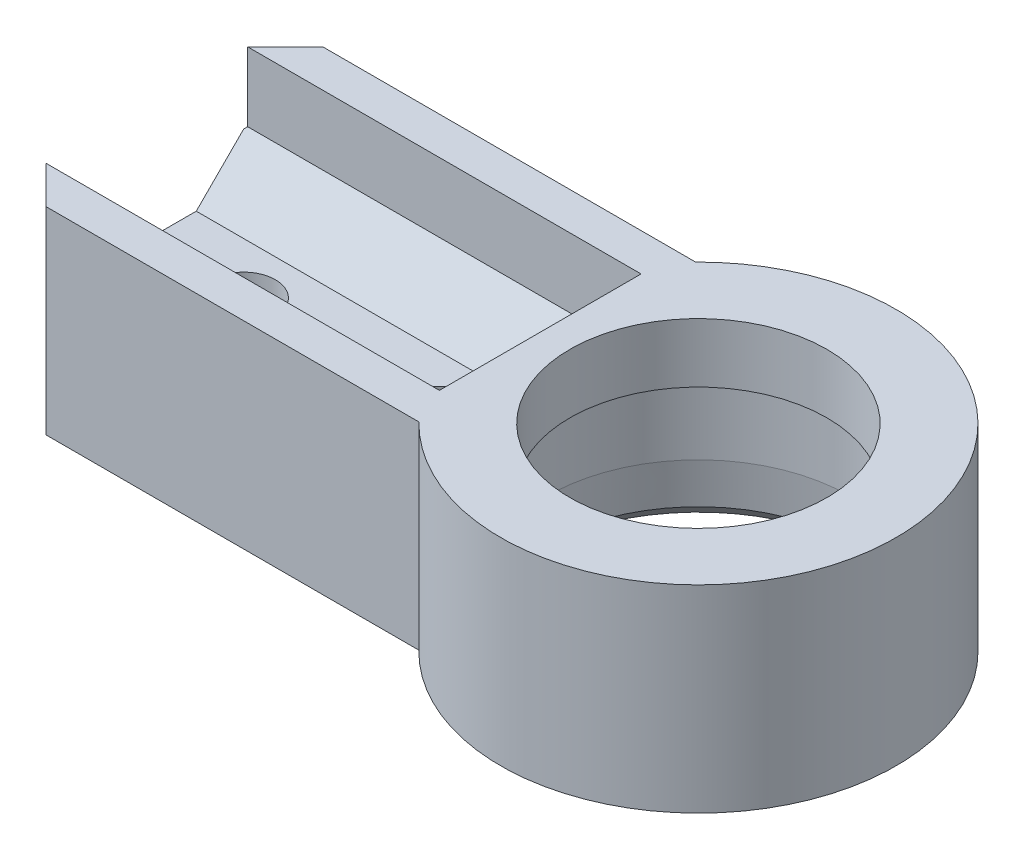
ISO-10303-21;
HEADER;
FILE_DESCRIPTION(('STEP AP214'),'2;1');
FILE_NAME('part.step','',(''),(''),'','','');
FILE_SCHEMA(('AUTOMOTIVE_DESIGN { 1 0 10303 214 1 1 1 1 }'));
ENDSEC;
DATA;
#1=APPLICATION_CONTEXT('core data for automotive mechanical design processes');
#2=APPLICATION_PROTOCOL_DEFINITION('international standard','automotive_design',2000,#1);
#3=PRODUCT_CONTEXT('',#1,'mechanical');
#4=PRODUCT('Part','Part','',(#3));
#5=PRODUCT_RELATED_PRODUCT_CATEGORY('part','',(#4));
#6=PRODUCT_DEFINITION_FORMATION('','',#4);
#7=PRODUCT_DEFINITION_CONTEXT('part definition',#1,'design');
#8=PRODUCT_DEFINITION('design','',#6,#7);
#9=PRODUCT_DEFINITION_SHAPE('','',#8);
#10=(LENGTH_UNIT() NAMED_UNIT(*) SI_UNIT(.MILLI.,.METRE.));
#11=(NAMED_UNIT(*) PLANE_ANGLE_UNIT() SI_UNIT($,.RADIAN.));
#12=(NAMED_UNIT(*) SI_UNIT($,.STERADIAN.) SOLID_ANGLE_UNIT());
#13=UNCERTAINTY_MEASURE_WITH_UNIT(LENGTH_MEASURE(1.E-05),#10,'distance_accuracy_value','');
#14=(GEOMETRIC_REPRESENTATION_CONTEXT(3) GLOBAL_UNCERTAINTY_ASSIGNED_CONTEXT((#13)) GLOBAL_UNIT_ASSIGNED_CONTEXT((#10,
#11,#12)) REPRESENTATION_CONTEXT('',''));
#15=CARTESIAN_POINT('',(0.,0.,0.));
#16=DIRECTION('',(0.,0.,1.));
#17=DIRECTION('',(1.,0.,0.));
#18=AXIS2_PLACEMENT_3D('',#15,#16,#17);
#19=CARTESIAN_POINT('',(0.,10.,0.));
#20=DIRECTION('',(0.,-1.,0.));
#21=DIRECTION('',(0.,0.,-1.));
#22=AXIS2_PLACEMENT_3D('',#19,#20,#21);
#23=CYLINDRICAL_SURFACE('',#22,6.5);
#24=CARTESIAN_POINT('',(0.,10.,0.));
#25=DIRECTION('',(0.,-1.,0.));
#26=DIRECTION('',(0.,0.,-1.));
#27=AXIS2_PLACEMENT_3D('',#24,#25,#26);
#28=CIRCLE('',#27,6.5);
#29=CARTESIAN_POINT('',(0.,10.,-6.5));
#30=VERTEX_POINT('',#29);
#31=EDGE_CURVE('E224',#30,#30,#28,.T.);
#32=ORIENTED_EDGE('',*,*,#31,.F.);
#33=EDGE_LOOP('',(#32));
#34=FACE_BOUND('',#33,.T.);
#35=CARTESIAN_POINT('',(0.,7.,0.));
#36=DIRECTION('',(0.,-1.,0.));
#37=DIRECTION('',(0.,0.,-1.));
#38=AXIS2_PLACEMENT_3D('',#35,#36,#37);
#39=CIRCLE('',#38,6.5);
#40=CARTESIAN_POINT('',(0.,7.,-6.5));
#41=VERTEX_POINT('',#40);
#42=EDGE_CURVE('E227',#41,#41,#39,.F.);
#43=ORIENTED_EDGE('',*,*,#42,.F.);
#44=EDGE_LOOP('',(#43));
#45=FACE_BOUND('',#44,.T.);
#46=ADVANCED_FACE('F33',(#34,#45),#23,.F.);
#47=CARTESIAN_POINT('',(0.,10.,0.));
#48=DIRECTION('',(0.,-1.,0.));
#49=DIRECTION('',(0.,0.,-1.));
#50=AXIS2_PLACEMENT_3D('',#47,#48,#49);
#51=CYLINDRICAL_SURFACE('',#50,10.);
#52=CARTESIAN_POINT('',(0.,0.,0.));
#53=DIRECTION('',(0.,1.,0.));
#54=DIRECTION('',(0.,0.,1.));
#55=AXIS2_PLACEMENT_3D('',#52,#53,#54);
#56=CIRCLE('',#55,10.);
#57=CARTESIAN_POINT('',(-7.14142842854285,0.,7.));
#58=VERTEX_POINT('',#57);
#59=CARTESIAN_POINT('',(-7.14142842854285,0.,-7.));
#60=VERTEX_POINT('',#59);
#61=EDGE_CURVE('E161',#58,#60,#56,.T.);
#62=ORIENTED_EDGE('',*,*,#61,.T.);
#63=DIRECTION('',(0.,-1.,0.));
#64=VECTOR('',#63,1.);
#65=CARTESIAN_POINT('',(-7.14142842854285,10.,-7.));
#66=LINE('',#65,#64);
#67=CARTESIAN_POINT('',(-7.14142842854285,10.,-7.));
#68=VERTEX_POINT('',#67);
#69=EDGE_CURVE('E186',#68,#60,#66,.T.);
#70=ORIENTED_EDGE('',*,*,#69,.F.);
#71=CARTESIAN_POINT('',(0.,10.,0.));
#72=DIRECTION('',(0.,1.,0.));
#73=DIRECTION('',(0.,0.,1.));
#74=AXIS2_PLACEMENT_3D('',#71,#72,#73);
#75=CIRCLE('',#74,10.);
#76=CARTESIAN_POINT('',(-7.14142842854285,10.,7.));
#77=VERTEX_POINT('',#76);
#78=EDGE_CURVE('E169',#77,#68,#75,.T.);
#79=ORIENTED_EDGE('',*,*,#78,.F.);
#80=DIRECTION('',(0.,-1.,0.));
#81=VECTOR('',#80,1.);
#82=CARTESIAN_POINT('',(-7.14142842854285,10.,7.));
#83=LINE('',#82,#81);
#84=EDGE_CURVE('E176',#77,#58,#83,.T.);
#85=ORIENTED_EDGE('',*,*,#84,.T.);
#86=EDGE_LOOP('',(#62,#70,#79,#85));
#87=FACE_BOUND('',#86,.T.);
#88=ADVANCED_FACE('F289',(#87),#51,.T.);
#89=CARTESIAN_POINT('',(-28.,10.,-7.));
#90=DIRECTION('',(0.,0.,1.));
#91=DIRECTION('',(1.,0.,0.));
#92=AXIS2_PLACEMENT_3D('',#89,#90,#91);
#93=PLANE('',#92);
#94=DIRECTION('',(-1.,0.,0.));
#95=VECTOR('',#94,1.);
#96=CARTESIAN_POINT('',(-28.,0.,-7.));
#97=LINE('',#96,#95);
#98=CARTESIAN_POINT('',(-26.,0.,-7.));
#99=VERTEX_POINT('',#98);
#100=EDGE_CURVE('E164',#60,#99,#97,.T.);
#101=ORIENTED_EDGE('',*,*,#100,.T.);
#102=DIRECTION('',(0.,1.,0.));
#103=VECTOR('',#102,1.);
#104=CARTESIAN_POINT('',(-26.,10.,-7.));
#105=LINE('',#104,#103);
#106=CARTESIAN_POINT('',(-26.,10.,-7.));
#107=VERTEX_POINT('',#106);
#108=EDGE_CURVE('E260',#99,#107,#105,.T.);
#109=ORIENTED_EDGE('',*,*,#108,.T.);
#110=DIRECTION('',(-1.,0.,0.));
#111=VECTOR('',#110,1.);
#112=CARTESIAN_POINT('',(-28.,10.,-7.));
#113=LINE('',#112,#111);
#114=EDGE_CURVE('E172',#68,#107,#113,.T.);
#115=ORIENTED_EDGE('',*,*,#114,.F.);
#116=ORIENTED_EDGE('',*,*,#69,.T.);
#117=EDGE_LOOP('',(#101,#109,#115,#116));
#118=FACE_BOUND('',#117,.T.);
#119=ADVANCED_FACE('F295',(#118),#93,.F.);
#120=CARTESIAN_POINT('',(-28.,10.,7.));
#121=DIRECTION('',(1.,0.,0.));
#122=DIRECTION('',(0.,0.,-1.));
#123=AXIS2_PLACEMENT_3D('',#120,#121,#122);
#124=PLANE('',#123);
#125=DIRECTION('',(0.,-0.707106781186543,0.707106781186552));
#126=VECTOR('',#125,1.);
#127=CARTESIAN_POINT('',(-28.,2.19999999999998,-0.799999999999925));
#128=LINE('',#127,#126);
#129=CARTESIAN_POINT('',(-28.,4.,-2.59999999999997));
#130=VERTEX_POINT('',#129);
#131=CARTESIAN_POINT('',(-28.,6.4,-5.));
#132=VERTEX_POINT('',#131);
#133=EDGE_CURVE('E200',#130,#132,#128,.F.);
#134=ORIENTED_EDGE('',*,*,#133,.T.);
#135=DIRECTION('',(0.,-1.,0.));
#136=VECTOR('',#135,1.);
#137=CARTESIAN_POINT('',(-28.,10.,-5.00000000000001));
#138=LINE('',#137,#136);
#139=CARTESIAN_POINT('',(-28.,0.,-5.00000000000001));
#140=VERTEX_POINT('',#139);
#141=EDGE_CURVE('E253',#132,#140,#138,.T.);
#142=ORIENTED_EDGE('',*,*,#141,.T.);
#143=DIRECTION('',(0.,0.,1.));
#144=VECTOR('',#143,1.);
#145=CARTESIAN_POINT('',(-28.,0.,7.));
#146=LINE('',#145,#144);
#147=CARTESIAN_POINT('',(-28.,0.,4.99999999999999));
#148=VERTEX_POINT('',#147);
#149=EDGE_CURVE('E180',#140,#148,#146,.T.);
#150=ORIENTED_EDGE('',*,*,#149,.T.);
#151=DIRECTION('',(0.,1.,0.));
#152=VECTOR('',#151,1.);
#153=CARTESIAN_POINT('',(-28.,10.,4.99999999999999));
#154=LINE('',#153,#152);
#155=CARTESIAN_POINT('',(-28.,6.40000000000001,5.));
#156=VERTEX_POINT('',#155);
#157=EDGE_CURVE('E251',#148,#156,#154,.T.);
#158=ORIENTED_EDGE('',*,*,#157,.T.);
#159=DIRECTION('',(0.,0.707106781186551,0.707106781186544));
#160=VECTOR('',#159,1.);
#161=CARTESIAN_POINT('',(-28.,9.20000000000002,7.79999999999998));
#162=LINE('',#161,#160);
#163=CARTESIAN_POINT('',(-28.,4.,2.60000000000001));
#164=VERTEX_POINT('',#163);
#165=EDGE_CURVE('E198',#156,#164,#162,.F.);
#166=ORIENTED_EDGE('',*,*,#165,.T.);
#167=DIRECTION('',(0.,0.,1.));
#168=VECTOR('',#167,1.);
#169=CARTESIAN_POINT('',(-28.,4.,-5.1));
#170=LINE('',#169,#168);
#171=EDGE_CURVE('E145',#130,#164,#170,.T.);
#172=ORIENTED_EDGE('',*,*,#171,.F.);
#173=EDGE_LOOP('',(#134,#142,#150,#158,#166,#172));
#174=FACE_BOUND('',#173,.T.);
#175=ADVANCED_FACE('F326',(#174),#124,.F.);
#176=CARTESIAN_POINT('',(-28.,10.,7.));
#177=DIRECTION('',(0.,0.,-1.));
#178=DIRECTION('',(-1.,0.,0.));
#179=AXIS2_PLACEMENT_3D('',#176,#177,#178);
#180=PLANE('',#179);
#181=DIRECTION('',(1.,0.,0.));
#182=VECTOR('',#181,1.);
#183=CARTESIAN_POINT('',(-28.,10.,7.));
#184=LINE('',#183,#182);
#185=CARTESIAN_POINT('',(-26.,10.,7.));
#186=VERTEX_POINT('',#185);
#187=EDGE_CURVE('E175',#186,#77,#184,.T.);
#188=ORIENTED_EDGE('',*,*,#187,.F.);
#189=DIRECTION('',(0.,-1.,0.));
#190=VECTOR('',#189,1.);
#191=CARTESIAN_POINT('',(-26.,10.,7.));
#192=LINE('',#191,#190);
#193=CARTESIAN_POINT('',(-26.,0.,7.));
#194=VERTEX_POINT('',#193);
#195=EDGE_CURVE('E268',#186,#194,#192,.T.);
#196=ORIENTED_EDGE('',*,*,#195,.T.);
#197=DIRECTION('',(1.,0.,0.));
#198=VECTOR('',#197,1.);
#199=CARTESIAN_POINT('',(-28.,0.,7.));
#200=LINE('',#199,#198);
#201=EDGE_CURVE('E173',#194,#58,#200,.T.);
#202=ORIENTED_EDGE('',*,*,#201,.T.);
#203=ORIENTED_EDGE('',*,*,#84,.F.);
#204=EDGE_LOOP('',(#188,#196,#202,#203));
#205=FACE_BOUND('',#204,.T.);
#206=ADVANCED_FACE('F319',(#205),#180,.F.);
#207=CARTESIAN_POINT('',(0.,10.,0.));
#208=DIRECTION('',(0.,1.,0.));
#209=DIRECTION('',(0.,0.,1.));
#210=AXIS2_PLACEMENT_3D('',#207,#208,#209);
#211=PLANE('',#210);
#212=ORIENTED_EDGE('',*,*,#31,.T.);
#213=EDGE_LOOP('',(#212));
#214=FACE_BOUND('',#213,.T.);
#215=ORIENTED_EDGE('',*,*,#114,.T.);
#216=DIRECTION('',(0.707106781186549,0.,-0.707106781186546));
#217=VECTOR('',#216,1.);
#218=CARTESIAN_POINT('',(-16.4999999999999,10.,-16.5));
#219=LINE('',#218,#217);
#220=CARTESIAN_POINT('',(-27.9,10.,-5.1));
#221=VERTEX_POINT('',#220);
#222=EDGE_CURVE('E160',#107,#221,#219,.F.);
#223=ORIENTED_EDGE('',*,*,#222,.T.);
#224=DIRECTION('',(-1.,0.,0.));
#225=VECTOR('',#224,1.);
#226=CARTESIAN_POINT('',(-8.,10.,-5.1));
#227=LINE('',#226,#225);
#228=CARTESIAN_POINT('',(-8.,10.,-5.1));
#229=VERTEX_POINT('',#228);
#230=EDGE_CURVE('E139',#229,#221,#227,.T.);
#231=ORIENTED_EDGE('',*,*,#230,.F.);
#232=DIRECTION('',(0.,0.,-1.));
#233=VECTOR('',#232,1.);
#234=CARTESIAN_POINT('',(-8.,10.,-5.1));
#235=LINE('',#234,#233);
#236=CARTESIAN_POINT('',(-8.,10.,5.1));
#237=VERTEX_POINT('',#236);
#238=EDGE_CURVE('E148',#237,#229,#235,.T.);
#239=ORIENTED_EDGE('',*,*,#238,.F.);
#240=DIRECTION('',(-1.,0.,0.));
#241=VECTOR('',#240,1.);
#242=CARTESIAN_POINT('',(-8.,10.,5.1));
#243=LINE('',#242,#241);
#244=CARTESIAN_POINT('',(-27.9,10.,5.1));
#245=VERTEX_POINT('',#244);
#246=EDGE_CURVE('E155',#237,#245,#243,.T.);
#247=ORIENTED_EDGE('',*,*,#246,.T.);
#248=DIRECTION('',(-0.707106781186546,0.,-0.707106781186549));
#249=VECTOR('',#248,1.);
#250=CARTESIAN_POINT('',(-16.5000000000001,10.,16.5));
#251=LINE('',#250,#249);
#252=EDGE_CURVE('E262',#245,#186,#251,.F.);
#253=ORIENTED_EDGE('',*,*,#252,.T.);
#254=ORIENTED_EDGE('',*,*,#187,.T.);
#255=ORIENTED_EDGE('',*,*,#78,.T.);
#256=EDGE_LOOP('',(#215,#223,#231,#239,#247,#253,#254,#255));
#257=FACE_BOUND('',#256,.T.);
#258=ADVANCED_FACE('F158',(#214,#257),#211,.T.);
#259=CARTESIAN_POINT('',(0.,0.,0.));
#260=DIRECTION('',(0.,1.,0.));
#261=DIRECTION('',(0.,0.,1.));
#262=AXIS2_PLACEMENT_3D('',#259,#260,#261);
#263=PLANE('',#262);
#264=CARTESIAN_POINT('',(-23.,0.,0.));
#265=DIRECTION('',(0.,1.,0.));
#266=DIRECTION('',(0.,0.,1.));
#267=AXIS2_PLACEMENT_3D('',#264,#265,#266);
#268=CIRCLE('',#267,3.70000000000001);
#269=CARTESIAN_POINT('',(-23.,0.,3.70000000000001));
#270=VERTEX_POINT('',#269);
#271=EDGE_CURVE('E245',#270,#270,#268,.T.);
#272=ORIENTED_EDGE('',*,*,#271,.T.);
#273=EDGE_LOOP('',(#272));
#274=FACE_BOUND('',#273,.T.);
#275=CARTESIAN_POINT('',(-13.,0.,0.));
#276=DIRECTION('',(0.,1.,0.));
#277=DIRECTION('',(0.,0.,1.));
#278=AXIS2_PLACEMENT_3D('',#275,#276,#277);
#279=CIRCLE('',#278,3.70000000000001);
#280=CARTESIAN_POINT('',(-13.,0.,3.70000000000001));
#281=VERTEX_POINT('',#280);
#282=EDGE_CURVE('E242',#281,#281,#279,.T.);
#283=ORIENTED_EDGE('',*,*,#282,.T.);
#284=EDGE_LOOP('',(#283));
#285=FACE_BOUND('',#284,.T.);
#286=CARTESIAN_POINT('',(0.,0.,0.));
#287=DIRECTION('',(0.,1.,0.));
#288=DIRECTION('',(0.,0.,1.));
#289=AXIS2_PLACEMENT_3D('',#286,#287,#288);
#290=CIRCLE('',#289,8.65000000000001);
#291=CARTESIAN_POINT('',(0.,0.,8.65000000000001));
#292=VERTEX_POINT('',#291);
#293=EDGE_CURVE('E219',#292,#292,#290,.T.);
#294=ORIENTED_EDGE('',*,*,#293,.T.);
#295=EDGE_LOOP('',(#294));
#296=FACE_BOUND('',#295,.T.);
#297=ORIENTED_EDGE('',*,*,#149,.F.);
#298=DIRECTION('',(-0.707106781186549,0.,0.707106781186546));
#299=VECTOR('',#298,1.);
#300=CARTESIAN_POINT('',(-28.,0.,-5.00000000000001));
#301=LINE('',#300,#299);
#302=EDGE_CURVE('E258',#140,#99,#301,.F.);
#303=ORIENTED_EDGE('',*,*,#302,.T.);
#304=ORIENTED_EDGE('',*,*,#100,.F.);
#305=ORIENTED_EDGE('',*,*,#61,.F.);
#306=ORIENTED_EDGE('',*,*,#201,.F.);
#307=DIRECTION('',(0.707106781186546,0.,0.707106781186549));
#308=VECTOR('',#307,1.);
#309=CARTESIAN_POINT('',(-26.,0.,7.));
#310=LINE('',#309,#308);
#311=EDGE_CURVE('E256',#194,#148,#310,.F.);
#312=ORIENTED_EDGE('',*,*,#311,.T.);
#313=EDGE_LOOP('',(#297,#303,#304,#305,#306,#312));
#314=FACE_BOUND('',#313,.T.);
#315=ADVANCED_FACE('F316',(#274,#285,#296,#314),#263,.F.);
#316=CARTESIAN_POINT('',(-8.,10.,-5.1));
#317=DIRECTION('',(0.,0.,-1.));
#318=DIRECTION('',(-1.,0.,0.));
#319=AXIS2_PLACEMENT_3D('',#316,#317,#318);
#320=PLANE('',#319);
#321=ORIENTED_EDGE('',*,*,#230,.T.);
#322=DIRECTION('',(0.,1.,0.));
#323=VECTOR('',#322,1.);
#324=CARTESIAN_POINT('',(-27.9,10.,-5.1));
#325=LINE('',#324,#323);
#326=CARTESIAN_POINT('',(-27.9,6.5,-5.1));
#327=VERTEX_POINT('',#326);
#328=EDGE_CURVE('E56',#221,#327,#325,.F.);
#329=ORIENTED_EDGE('',*,*,#328,.T.);
#330=DIRECTION('',(1.,0.,0.));
#331=VECTOR('',#330,1.);
#332=CARTESIAN_POINT('',(-8.,6.5,-5.1));
#333=LINE('',#332,#331);
#334=CARTESIAN_POINT('',(-9.79999999999999,6.5,-5.1));
#335=VERTEX_POINT('',#334);
#336=EDGE_CURVE('E196',#327,#335,#333,.T.);
#337=ORIENTED_EDGE('',*,*,#336,.T.);
#338=DIRECTION('',(-0.577350269189624,-0.816496580927727,0.));
#339=VECTOR('',#338,1.);
#340=CARTESIAN_POINT('',(-11.334146220588,4.33038960818106,-5.1));
#341=LINE('',#340,#339);
#342=CARTESIAN_POINT('',(-8.,9.04558441227156,-5.1));
#343=VERTEX_POINT('',#342);
#344=EDGE_CURVE('E141',#335,#343,#341,.F.);
#345=ORIENTED_EDGE('',*,*,#344,.T.);
#346=DIRECTION('',(0.,-1.,0.));
#347=VECTOR('',#346,1.);
#348=CARTESIAN_POINT('',(-8.,10.,-5.1));
#349=LINE('',#348,#347);
#350=EDGE_CURVE('E135',#229,#343,#349,.T.);
#351=ORIENTED_EDGE('',*,*,#350,.F.);
#352=EDGE_LOOP('',(#321,#329,#337,#345,#351));
#353=FACE_BOUND('',#352,.T.);
#354=ADVANCED_FACE('F137',(#353),#320,.F.);
#355=CARTESIAN_POINT('',(-8.,10.,5.1));
#356=DIRECTION('',(0.,0.,1.));
#357=DIRECTION('',(1.,0.,0.));
#358=AXIS2_PLACEMENT_3D('',#355,#356,#357);
#359=PLANE('',#358);
#360=DIRECTION('',(-1.,0.,0.));
#361=VECTOR('',#360,1.);
#362=CARTESIAN_POINT('',(-28.,6.50000000000001,5.1));
#363=LINE('',#362,#361);
#364=CARTESIAN_POINT('',(-9.79999999999999,6.50000000000001,5.1));
#365=VERTEX_POINT('',#364);
#366=CARTESIAN_POINT('',(-27.9,6.50000000000001,5.1));
#367=VERTEX_POINT('',#366);
#368=EDGE_CURVE('E189',#365,#367,#363,.T.);
#369=ORIENTED_EDGE('',*,*,#368,.T.);
#370=DIRECTION('',(0.,-1.,0.));
#371=VECTOR('',#370,1.);
#372=CARTESIAN_POINT('',(-27.9,10.,5.1));
#373=LINE('',#372,#371);
#374=EDGE_CURVE('E272',#367,#245,#373,.F.);
#375=ORIENTED_EDGE('',*,*,#374,.T.);
#376=ORIENTED_EDGE('',*,*,#246,.F.);
#377=DIRECTION('',(0.,1.,0.));
#378=VECTOR('',#377,1.);
#379=CARTESIAN_POINT('',(-8.,10.,5.1));
#380=LINE('',#379,#378);
#381=CARTESIAN_POINT('',(-8.,9.0455844122716,5.1));
#382=VERTEX_POINT('',#381);
#383=EDGE_CURVE('E144',#382,#237,#380,.T.);
#384=ORIENTED_EDGE('',*,*,#383,.F.);
#385=DIRECTION('',(0.57735026918962,0.81649658092773,0.));
#386=VECTOR('',#385,1.);
#387=CARTESIAN_POINT('',(-11.334146220588,4.33038960818099,5.1));
#388=LINE('',#387,#386);
#389=EDGE_CURVE('E209',#382,#365,#388,.F.);
#390=ORIENTED_EDGE('',*,*,#389,.T.);
#391=EDGE_LOOP('',(#369,#375,#376,#384,#390));
#392=FACE_BOUND('',#391,.T.);
#393=ADVANCED_FACE('F307',(#392),#359,.F.);
#394=CARTESIAN_POINT('',(-8.,4.,-5.1));
#395=DIRECTION('',(0.,-1.,0.));
#396=DIRECTION('',(0.,0.,-1.));
#397=AXIS2_PLACEMENT_3D('',#394,#395,#396);
#398=PLANE('',#397);
#399=CARTESIAN_POINT('',(-13.,4.,0.));
#400=DIRECTION('',(0.,-1.,0.));
#401=DIRECTION('',(0.,0.,-1.));
#402=AXIS2_PLACEMENT_3D('',#399,#400,#401);
#403=CIRCLE('',#402,1.6);
#404=CARTESIAN_POINT('',(-13.,4.,-1.6));
#405=VERTEX_POINT('',#404);
#406=EDGE_CURVE('E237',#405,#405,#403,.T.);
#407=ORIENTED_EDGE('',*,*,#406,.T.);
#408=EDGE_LOOP('',(#407));
#409=FACE_BOUND('',#408,.T.);
#410=CARTESIAN_POINT('',(-23.,4.,0.));
#411=DIRECTION('',(0.,-1.,0.));
#412=DIRECTION('',(0.,0.,-1.));
#413=AXIS2_PLACEMENT_3D('',#410,#411,#412);
#414=CIRCLE('',#413,1.6);
#415=CARTESIAN_POINT('',(-23.,4.,-1.6));
#416=VERTEX_POINT('',#415);
#417=EDGE_CURVE('E234',#416,#416,#414,.T.);
#418=ORIENTED_EDGE('',*,*,#417,.T.);
#419=EDGE_LOOP('',(#418));
#420=FACE_BOUND('',#419,.T.);
#421=DIRECTION('',(1.,0.,0.));
#422=VECTOR('',#421,1.);
#423=CARTESIAN_POINT('',(-8.,4.,2.60000000000001));
#424=LINE('',#423,#422);
#425=CARTESIAN_POINT('',(-9.79999999999999,4.,2.60000000000001));
#426=VERTEX_POINT('',#425);
#427=EDGE_CURVE('E193',#164,#426,#424,.T.);
#428=ORIENTED_EDGE('',*,*,#427,.T.);
#429=DIRECTION('',(0.,0.,-1.));
#430=VECTOR('',#429,1.);
#431=CARTESIAN_POINT('',(-9.79999999999999,4.,-5.1));
#432=LINE('',#431,#430);
#433=CARTESIAN_POINT('',(-9.79999999999999,4.,-2.59999999999997));
#434=VERTEX_POINT('',#433);
#435=EDGE_CURVE('E213',#426,#434,#432,.T.);
#436=ORIENTED_EDGE('',*,*,#435,.T.);
#437=DIRECTION('',(-1.,0.,0.));
#438=VECTOR('',#437,1.);
#439=CARTESIAN_POINT('',(-28.,4.,-2.59999999999997));
#440=LINE('',#439,#438);
#441=EDGE_CURVE('E191',#434,#130,#440,.T.);
#442=ORIENTED_EDGE('',*,*,#441,.T.);
#443=ORIENTED_EDGE('',*,*,#171,.T.);
#444=EDGE_LOOP('',(#428,#436,#442,#443));
#445=FACE_BOUND('',#444,.T.);
#446=ADVANCED_FACE('F306',(#409,#420,#445),#398,.F.);
#447=CARTESIAN_POINT('',(-8.,0.,0.));
#448=DIRECTION('',(-1.,0.,0.));
#449=DIRECTION('',(0.,0.,1.));
#450=AXIS2_PLACEMENT_3D('',#447,#448,#449);
#451=PLANE('',#450);
#452=DIRECTION('',(0.,0.,1.));
#453=VECTOR('',#452,1.);
#454=CARTESIAN_POINT('',(-8.,5.8,0.));
#455=LINE('',#454,#453);
#456=CARTESIAN_POINT('',(-8.,5.8,-1.85441558772841));
#457=VERTEX_POINT('',#456);
#458=CARTESIAN_POINT('',(-8.,5.8,1.85441558772843));
#459=VERTEX_POINT('',#458);
#460=EDGE_CURVE('E205',#457,#459,#455,.T.);
#461=ORIENTED_EDGE('',*,*,#460,.T.);
#462=DIRECTION('',(0.,0.707106781186551,0.707106781186544));
#463=VECTOR('',#462,1.);
#464=CARTESIAN_POINT('',(-8.,1.97279220613576,-1.97279220613578));
#465=LINE('',#464,#463);
#466=EDGE_CURVE('E207',#459,#382,#465,.T.);
#467=ORIENTED_EDGE('',*,*,#466,.T.);
#468=ORIENTED_EDGE('',*,*,#383,.T.);
#469=ORIENTED_EDGE('',*,*,#238,.T.);
#470=ORIENTED_EDGE('',*,*,#350,.T.);
#471=DIRECTION('',(0.,-0.707106781186543,0.707106781186552));
#472=VECTOR('',#471,1.);
#473=CARTESIAN_POINT('',(-8.,1.97279220613583,1.97279220613581));
#474=LINE('',#473,#472);
#475=EDGE_CURVE('E203',#343,#457,#474,.T.);
#476=ORIENTED_EDGE('',*,*,#475,.T.);
#477=EDGE_LOOP('',(#461,#467,#468,#469,#470,#476));
#478=FACE_BOUND('',#477,.T.);
#479=ADVANCED_FACE('F149',(#478),#451,.T.);
#480=CARTESIAN_POINT('',(-8.,6.50000000000001,5.1));
#481=DIRECTION('',(0.,0.707106781186544,-0.707106781186551));
#482=DIRECTION('',(1.,0.,0.));
#483=AXIS2_PLACEMENT_3D('',#480,#481,#482);
#484=PLANE('',#483);
#485=ORIENTED_EDGE('',*,*,#165,.F.);
#486=DIRECTION('',(0.577350269189622,0.577350269189631,0.577350269189625));
#487=VECTOR('',#486,1.);
#488=CARTESIAN_POINT('',(-25.4666666666667,8.93333333333336,7.53333333333333));
#489=LINE('',#488,#487);
#490=EDGE_CURVE('E48',#156,#367,#489,.T.);
#491=ORIENTED_EDGE('',*,*,#490,.T.);
#492=ORIENTED_EDGE('',*,*,#368,.F.);
#493=DIRECTION('',(0.,0.707106781186551,0.707106781186544));
#494=VECTOR('',#493,1.);
#495=CARTESIAN_POINT('',(-9.79999999999999,6.50000000000001,5.1));
#496=LINE('',#495,#494);
#497=EDGE_CURVE('E211',#365,#426,#496,.F.);
#498=ORIENTED_EDGE('',*,*,#497,.T.);
#499=ORIENTED_EDGE('',*,*,#427,.F.);
#500=EDGE_LOOP('',(#485,#491,#492,#498,#499));
#501=FACE_BOUND('',#500,.T.);
#502=ADVANCED_FACE('F305',(#501),#484,.T.);
#503=CARTESIAN_POINT('',(-8.,4.,-2.59999999999997));
#504=DIRECTION('',(0.,0.707106781186552,0.707106781186543));
#505=DIRECTION('',(1.,0.,0.));
#506=AXIS2_PLACEMENT_3D('',#503,#504,#505);
#507=PLANE('',#506);
#508=ORIENTED_EDGE('',*,*,#336,.F.);
#509=DIRECTION('',(-0.57735026918963,-0.57735026918962,0.577350269189627));
#510=VECTOR('',#509,1.);
#511=CARTESIAN_POINT('',(-26.8,7.59999999999998,-6.2));
#512=LINE('',#511,#510);
#513=EDGE_CURVE('E266',#327,#132,#512,.T.);
#514=ORIENTED_EDGE('',*,*,#513,.T.);
#515=ORIENTED_EDGE('',*,*,#133,.F.);
#516=ORIENTED_EDGE('',*,*,#441,.F.);
#517=DIRECTION('',(0.,-0.707106781186543,0.707106781186552));
#518=VECTOR('',#517,1.);
#519=CARTESIAN_POINT('',(-9.79999999999999,4.,-2.59999999999997));
#520=LINE('',#519,#518);
#521=EDGE_CURVE('E215',#434,#335,#520,.F.);
#522=ORIENTED_EDGE('',*,*,#521,.T.);
#523=EDGE_LOOP('',(#508,#514,#515,#516,#522));
#524=FACE_BOUND('',#523,.T.);
#525=ADVANCED_FACE('F336',(#524),#507,.T.);
#526=CARTESIAN_POINT('',(-8.,1.97279220613583,1.97279220613581));
#527=DIRECTION('',(-0.707106781186551,0.5,0.499999999999994));
#528=DIRECTION('',(0.,0.707106781186543,-0.707106781186552));
#529=AXIS2_PLACEMENT_3D('',#526,#527,#528);
#530=PLANE('',#529);
#531=ORIENTED_EDGE('',*,*,#344,.F.);
#532=ORIENTED_EDGE('',*,*,#521,.F.);
#533=DIRECTION('',(-0.678598344545844,-0.678598344545851,-0.281084637714819));
#534=VECTOR('',#533,1.);
#535=CARTESIAN_POINT('',(-7.64628215084728,6.15371784915273,-1.70790085735591));
#536=LINE('',#535,#534);
#537=EDGE_CURVE('E223',#457,#434,#536,.T.);
#538=ORIENTED_EDGE('',*,*,#537,.F.);
#539=ORIENTED_EDGE('',*,*,#475,.F.);
#540=EDGE_LOOP('',(#531,#532,#538,#539));
#541=FACE_BOUND('',#540,.T.);
#542=ADVANCED_FACE('F339',(#541),#530,.T.);
#543=CARTESIAN_POINT('',(-8.,5.8,0.));
#544=DIRECTION('',(0.707106781186552,-0.707106781186543,0.));
#545=DIRECTION('',(0.,0.,1.));
#546=AXIS2_PLACEMENT_3D('',#543,#544,#545);
#547=PLANE('',#546);
#548=ORIENTED_EDGE('',*,*,#537,.T.);
#549=ORIENTED_EDGE('',*,*,#435,.F.);
#550=DIRECTION('',(-0.678598344545843,-0.67859834454585,0.281084637714824));
#551=VECTOR('',#550,1.);
#552=CARTESIAN_POINT('',(-9.0323975055931,4.76760249440689,2.28204863630525));
#553=LINE('',#552,#551);
#554=EDGE_CURVE('E220',#459,#426,#553,.T.);
#555=ORIENTED_EDGE('',*,*,#554,.F.);
#556=ORIENTED_EDGE('',*,*,#460,.F.);
#557=EDGE_LOOP('',(#548,#549,#555,#556));
#558=FACE_BOUND('',#557,.T.);
#559=ADVANCED_FACE('F345',(#558),#547,.F.);
#560=CARTESIAN_POINT('',(-8.,1.97279220613576,-1.97279220613578));
#561=DIRECTION('',(-0.707106781186552,0.499999999999995,-0.5));
#562=DIRECTION('',(0.,-0.707106781186551,-0.707106781186544));
#563=AXIS2_PLACEMENT_3D('',#560,#561,#562);
#564=PLANE('',#563);
#565=ORIENTED_EDGE('',*,*,#554,.T.);
#566=ORIENTED_EDGE('',*,*,#497,.F.);
#567=ORIENTED_EDGE('',*,*,#389,.F.);
#568=ORIENTED_EDGE('',*,*,#466,.F.);
#569=EDGE_LOOP('',(#565,#566,#567,#568));
#570=FACE_BOUND('',#569,.T.);
#571=ADVANCED_FACE('F341',(#570),#564,.T.);
#572=CARTESIAN_POINT('',(0.,7.,0.));
#573=DIRECTION('',(0.,-1.,0.));
#574=DIRECTION('',(0.,0.,-1.));
#575=AXIS2_PLACEMENT_3D('',#572,#573,#574);
#576=PLANE('',#575);
#577=CARTESIAN_POINT('',(0.,7.,0.));
#578=DIRECTION('',(0.,-1.,0.));
#579=DIRECTION('',(0.,0.,-1.));
#580=AXIS2_PLACEMENT_3D('',#577,#578,#579);
#581=CIRCLE('',#580,7.65);
#582=CARTESIAN_POINT('',(0.,7.,-7.65));
#583=VERTEX_POINT('',#582);
#584=EDGE_CURVE('E230',#583,#583,#581,.T.);
#585=ORIENTED_EDGE('',*,*,#584,.T.);
#586=EDGE_LOOP('',(#585));
#587=FACE_BOUND('',#586,.T.);
#588=ORIENTED_EDGE('',*,*,#42,.T.);
#589=EDGE_LOOP('',(#588));
#590=FACE_BOUND('',#589,.T.);
#591=ADVANCED_FACE('F344',(#587,#590),#576,.T.);
#592=CARTESIAN_POINT('',(0.,7.,0.));
#593=DIRECTION('',(0.,-1.,0.));
#594=DIRECTION('',(0.,0.,-1.));
#595=AXIS2_PLACEMENT_3D('',#592,#593,#594);
#596=CYLINDRICAL_SURFACE('',#595,7.65);
#597=CARTESIAN_POINT('',(0.,2.99999999999999,0.));
#598=DIRECTION('',(0.,-1.,0.));
#599=DIRECTION('',(0.,0.,-1.));
#600=AXIS2_PLACEMENT_3D('',#597,#598,#599);
#601=CIRCLE('',#600,7.65);
#602=CARTESIAN_POINT('',(0.,2.99999999999999,-7.65));
#603=VERTEX_POINT('',#602);
#604=EDGE_CURVE('E41',#603,#603,#601,.T.);
#605=ORIENTED_EDGE('',*,*,#604,.T.);
#606=EDGE_LOOP('',(#605));
#607=FACE_BOUND('',#606,.T.);
#608=ORIENTED_EDGE('',*,*,#584,.F.);
#609=EDGE_LOOP('',(#608));
#610=FACE_BOUND('',#609,.T.);
#611=ADVANCED_FACE('F276',(#607,#610),#596,.F.);
#612=CARTESIAN_POINT('',(0.,0.999999999999999,0.));
#613=DIRECTION('',(0.,-1.,0.));
#614=DIRECTION('',(0.,0.,-1.));
#615=AXIS2_PLACEMENT_3D('',#612,#613,#614);
#616=CONICAL_SURFACE('',#615,7.65,0.785398163397451);
#617=CARTESIAN_POINT('',(0.,0.8082464074058,0.));
#618=DIRECTION('',(0.,-1.,0.));
#619=DIRECTION('',(0.,0.,-1.));
#620=AXIS2_PLACEMENT_3D('',#617,#618,#619);
#621=CIRCLE('',#620,7.8417535925942);
#622=CARTESIAN_POINT('',(0.,0.8082464074058,-7.8417535925942));
#623=VERTEX_POINT('',#622);
#624=EDGE_CURVE('E11',#623,#623,#621,.F.);
#625=ORIENTED_EDGE('',*,*,#624,.T.);
#626=EDGE_LOOP('',(#625));
#627=FACE_BOUND('',#626,.T.);
#628=ORIENTED_EDGE('',*,*,#293,.F.);
#629=EDGE_LOOP('',(#628));
#630=FACE_BOUND('',#629,.T.);
#631=ADVANCED_FACE('F353',(#627,#630),#616,.F.);
#632=CARTESIAN_POINT('',(-23.,7.,0.));
#633=DIRECTION('',(0.,-1.,0.));
#634=DIRECTION('',(0.,0.,-1.));
#635=AXIS2_PLACEMENT_3D('',#632,#633,#634);
#636=CYLINDRICAL_SURFACE('',#635,1.6);
#637=CARTESIAN_POINT('',(-23.,2.10000000000001,0.));
#638=DIRECTION('',(0.,1.,0.));
#639=DIRECTION('',(0.,0.,1.));
#640=AXIS2_PLACEMENT_3D('',#637,#638,#639);
#641=CIRCLE('',#640,1.6);
#642=CARTESIAN_POINT('',(-23.,2.10000000000001,1.6));
#643=VERTEX_POINT('',#642);
#644=EDGE_CURVE('E233',#643,#643,#641,.F.);
#645=ORIENTED_EDGE('',*,*,#644,.T.);
#646=EDGE_LOOP('',(#645));
#647=FACE_BOUND('',#646,.T.);
#648=ORIENTED_EDGE('',*,*,#417,.F.);
#649=EDGE_LOOP('',(#648));
#650=FACE_BOUND('',#649,.T.);
#651=ADVANCED_FACE('F356',(#647,#650),#636,.F.);
#652=CARTESIAN_POINT('',(-13.,7.,0.));
#653=DIRECTION('',(0.,-1.,0.));
#654=DIRECTION('',(0.,0.,-1.));
#655=AXIS2_PLACEMENT_3D('',#652,#653,#654);
#656=CYLINDRICAL_SURFACE('',#655,1.6);
#657=CARTESIAN_POINT('',(-13.,2.10000000000001,0.));
#658=DIRECTION('',(0.,1.,0.));
#659=DIRECTION('',(0.,0.,1.));
#660=AXIS2_PLACEMENT_3D('',#657,#658,#659);
#661=CIRCLE('',#660,1.6);
#662=CARTESIAN_POINT('',(-13.,2.10000000000001,1.6));
#663=VERTEX_POINT('',#662);
#664=EDGE_CURVE('E248',#663,#663,#661,.F.);
#665=ORIENTED_EDGE('',*,*,#664,.T.);
#666=EDGE_LOOP('',(#665));
#667=FACE_BOUND('',#666,.T.);
#668=ORIENTED_EDGE('',*,*,#406,.F.);
#669=EDGE_LOOP('',(#668));
#670=FACE_BOUND('',#669,.T.);
#671=ADVANCED_FACE('F362',(#667,#670),#656,.F.);
#672=CARTESIAN_POINT('',(-23.,2.10000000000001,0.));
#673=DIRECTION('',(0.,-1.,0.));
#674=DIRECTION('',(0.,0.,-1.));
#675=AXIS2_PLACEMENT_3D('',#672,#673,#674);
#676=CONICAL_SURFACE('',#675,1.6,0.78539816339745);
#677=ORIENTED_EDGE('',*,*,#271,.F.);
#678=EDGE_LOOP('',(#677));
#679=FACE_BOUND('',#678,.T.);
#680=ORIENTED_EDGE('',*,*,#644,.F.);
#681=EDGE_LOOP('',(#680));
#682=FACE_BOUND('',#681,.T.);
#683=ADVANCED_FACE('F358',(#679,#682),#676,.F.);
#684=CARTESIAN_POINT('',(-13.,2.10000000000001,0.));
#685=DIRECTION('',(0.,-1.,0.));
#686=DIRECTION('',(0.,0.,-1.));
#687=AXIS2_PLACEMENT_3D('',#684,#685,#686);
#688=CONICAL_SURFACE('',#687,1.6,0.78539816339745);
#689=ORIENTED_EDGE('',*,*,#282,.F.);
#690=EDGE_LOOP('',(#689));
#691=FACE_BOUND('',#690,.T.);
#692=ORIENTED_EDGE('',*,*,#664,.F.);
#693=EDGE_LOOP('',(#692));
#694=FACE_BOUND('',#693,.T.);
#695=ADVANCED_FACE('F361',(#691,#694),#688,.F.);
#696=CARTESIAN_POINT('',(-28.,10.,-5.00000000000001));
#697=DIRECTION('',(0.707106781186546,0.,0.707106781186549));
#698=DIRECTION('',(0.,-1.,0.));
#699=AXIS2_PLACEMENT_3D('',#696,#697,#698);
#700=PLANE('',#699);
#701=ORIENTED_EDGE('',*,*,#222,.F.);
#702=ORIENTED_EDGE('',*,*,#108,.F.);
#703=ORIENTED_EDGE('',*,*,#302,.F.);
#704=ORIENTED_EDGE('',*,*,#141,.F.);
#705=ORIENTED_EDGE('',*,*,#513,.F.);
#706=ORIENTED_EDGE('',*,*,#328,.F.);
#707=EDGE_LOOP('',(#701,#702,#703,#704,#705,#706));
#708=FACE_BOUND('',#707,.T.);
#709=ADVANCED_FACE('F285',(#708),#700,.F.);
#710=CARTESIAN_POINT('',(-26.,10.,7.));
#711=DIRECTION('',(0.707106781186549,0.,-0.707106781186546));
#712=DIRECTION('',(0.,-1.,0.));
#713=AXIS2_PLACEMENT_3D('',#710,#711,#712);
#714=PLANE('',#713);
#715=ORIENTED_EDGE('',*,*,#490,.F.);
#716=ORIENTED_EDGE('',*,*,#157,.F.);
#717=ORIENTED_EDGE('',*,*,#311,.F.);
#718=ORIENTED_EDGE('',*,*,#195,.F.);
#719=ORIENTED_EDGE('',*,*,#252,.F.);
#720=ORIENTED_EDGE('',*,*,#374,.F.);
#721=EDGE_LOOP('',(#715,#716,#717,#718,#719,#720));
#722=FACE_BOUND('',#721,.T.);
#723=ADVANCED_FACE('F280',(#722),#714,.F.);
#724=CARTESIAN_POINT('',(0.,2.99999999999999,0.));
#725=DIRECTION('',(0.,-1.,0.));
#726=DIRECTION('',(0.,0.,-1.));
#727=AXIS2_PLACEMENT_3D('',#724,#725,#726);
#728=CONICAL_SURFACE('',#727,7.65,0.0872664625997128);
#729=ORIENTED_EDGE('',*,*,#624,.F.);
#730=EDGE_LOOP('',(#729));
#731=FACE_BOUND('',#730,.T.);
#732=ORIENTED_EDGE('',*,*,#604,.F.);
#733=EDGE_LOOP('',(#732));
#734=FACE_BOUND('',#733,.T.);
#735=ADVANCED_FACE('F35',(#731,#734),#728,.F.);
#736=CLOSED_SHELL('',(#46,#88,#119,#175,#206,#258,#315,#354,#393,#446,#479,#502,#525,#542,#559,
#571,#591,#611,#631,#651,#671,#683,#695,#709,#723,#735));
#737=MANIFOLD_SOLID_BREP('B2',#736);
#738=ADVANCED_BREP_SHAPE_REPRESENTATION('',(#18,#737),#14);
#739=SHAPE_DEFINITION_REPRESENTATION(#9,#738);
ENDSEC;
END-ISO-10303-21;
